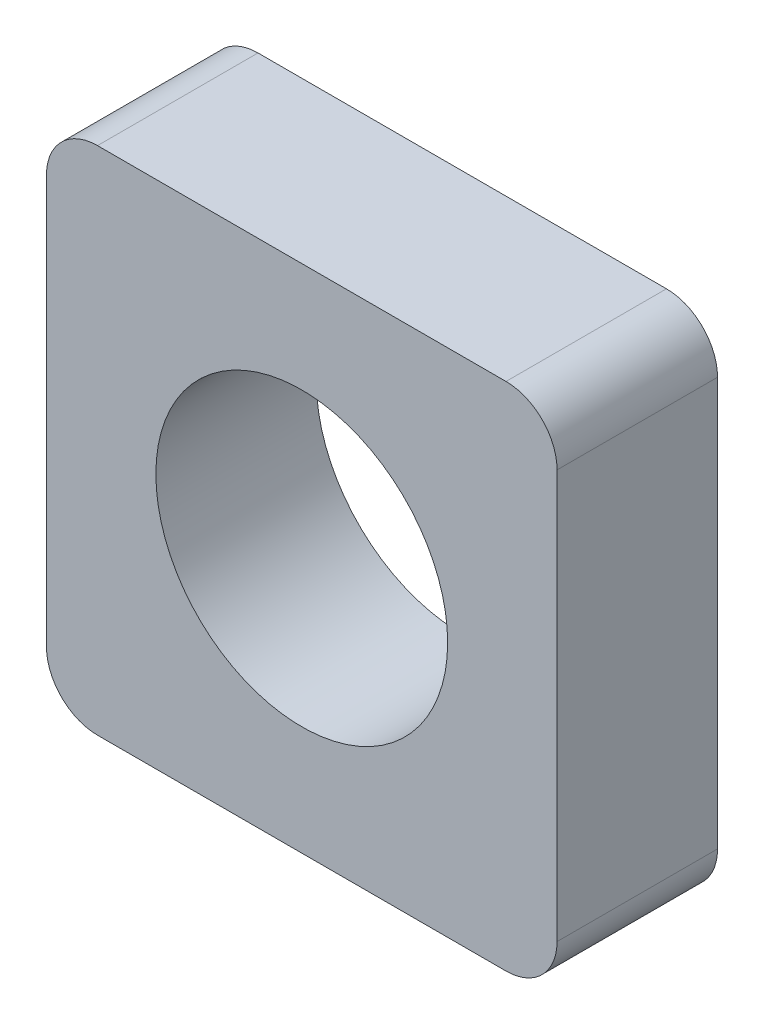
ISO-10303-21;
HEADER;
FILE_DESCRIPTION(('STEP AP214'),'2;1');
FILE_NAME('part.step','',(''),(''),'','','');
FILE_SCHEMA(('AUTOMOTIVE_DESIGN { 1 0 10303 214 1 1 1 1 }'));
ENDSEC;
DATA;
#1=APPLICATION_CONTEXT('core data for automotive mechanical design processes');
#2=APPLICATION_PROTOCOL_DEFINITION('international standard','automotive_design',2000,#1);
#3=PRODUCT_CONTEXT('',#1,'mechanical');
#4=PRODUCT('Part','Part','',(#3));
#5=PRODUCT_RELATED_PRODUCT_CATEGORY('part','',(#4));
#6=PRODUCT_DEFINITION_FORMATION('','',#4);
#7=PRODUCT_DEFINITION_CONTEXT('part definition',#1,'design');
#8=PRODUCT_DEFINITION('design','',#6,#7);
#9=PRODUCT_DEFINITION_SHAPE('','',#8);
#10=(LENGTH_UNIT() NAMED_UNIT(*) SI_UNIT(.MILLI.,.METRE.));
#11=(NAMED_UNIT(*) PLANE_ANGLE_UNIT() SI_UNIT($,.RADIAN.));
#12=(NAMED_UNIT(*) SI_UNIT($,.STERADIAN.) SOLID_ANGLE_UNIT());
#13=UNCERTAINTY_MEASURE_WITH_UNIT(LENGTH_MEASURE(1.E-05),#10,'distance_accuracy_value','');
#14=(GEOMETRIC_REPRESENTATION_CONTEXT(3) GLOBAL_UNCERTAINTY_ASSIGNED_CONTEXT((#13)) GLOBAL_UNIT_ASSIGNED_CONTEXT((#10,
#11,#12)) REPRESENTATION_CONTEXT('',''));
#15=CARTESIAN_POINT('',(0.,0.,0.));
#16=DIRECTION('',(0.,0.,1.));
#17=DIRECTION('',(1.,0.,0.));
#18=AXIS2_PLACEMENT_3D('',#15,#16,#17);
#19=CARTESIAN_POINT('',(0.,0.,2.2));
#20=DIRECTION('',(0.,0.,1.));
#21=DIRECTION('',(1.,0.,0.));
#22=AXIS2_PLACEMENT_3D('',#19,#20,#21);
#23=PLANE('',#22);
#24=DIRECTION('',(0.,-1.,0.));
#25=VECTOR('',#24,1.);
#26=CARTESIAN_POINT('',(-3.5,3.5,2.2));
#27=LINE('',#26,#25);
#28=CARTESIAN_POINT('',(-3.5,2.8,2.2));
#29=VERTEX_POINT('',#28);
#30=CARTESIAN_POINT('',(-3.5,-2.8,2.2));
#31=VERTEX_POINT('',#30);
#32=EDGE_CURVE('E178',#29,#31,#27,.T.);
#33=ORIENTED_EDGE('',*,*,#32,.T.);
#34=CARTESIAN_POINT('',(-2.8,-2.8,2.2));
#35=DIRECTION('',(0.,0.,1.));
#36=DIRECTION('',(1.,0.,0.));
#37=AXIS2_PLACEMENT_3D('',#34,#35,#36);
#38=CIRCLE('',#37,0.7);
#39=CARTESIAN_POINT('',(-2.8,-3.5,2.2));
#40=VERTEX_POINT('',#39);
#41=EDGE_CURVE('E161',#31,#40,#38,.T.);
#42=ORIENTED_EDGE('',*,*,#41,.T.);
#43=DIRECTION('',(1.,0.,0.));
#44=VECTOR('',#43,1.);
#45=CARTESIAN_POINT('',(-3.5,-3.5,2.2));
#46=LINE('',#45,#44);
#47=CARTESIAN_POINT('',(2.8,-3.5,2.2));
#48=VERTEX_POINT('',#47);
#49=EDGE_CURVE('E132',#40,#48,#46,.T.);
#50=ORIENTED_EDGE('',*,*,#49,.T.);
#51=CARTESIAN_POINT('',(2.8,-2.8,2.2));
#52=DIRECTION('',(0.,0.,1.));
#53=DIRECTION('',(1.,0.,0.));
#54=AXIS2_PLACEMENT_3D('',#51,#52,#53);
#55=CIRCLE('',#54,0.7);
#56=CARTESIAN_POINT('',(3.5,-2.8,2.2));
#57=VERTEX_POINT('',#56);
#58=EDGE_CURVE('E159',#48,#57,#55,.T.);
#59=ORIENTED_EDGE('',*,*,#58,.T.);
#60=DIRECTION('',(0.,1.,0.));
#61=VECTOR('',#60,1.);
#62=CARTESIAN_POINT('',(3.5,3.5,2.2));
#63=LINE('',#62,#61);
#64=CARTESIAN_POINT('',(3.5,2.8,2.2));
#65=VERTEX_POINT('',#64);
#66=EDGE_CURVE('E139',#57,#65,#63,.T.);
#67=ORIENTED_EDGE('',*,*,#66,.T.);
#68=CARTESIAN_POINT('',(2.8,2.8,2.2));
#69=DIRECTION('',(0.,0.,1.));
#70=DIRECTION('',(1.,0.,0.));
#71=AXIS2_PLACEMENT_3D('',#68,#69,#70);
#72=CIRCLE('',#71,0.7);
#73=CARTESIAN_POINT('',(2.8,3.5,2.2));
#74=VERTEX_POINT('',#73);
#75=EDGE_CURVE('E67',#65,#74,#72,.T.);
#76=ORIENTED_EDGE('',*,*,#75,.T.);
#77=DIRECTION('',(-1.,0.,0.));
#78=VECTOR('',#77,1.);
#79=CARTESIAN_POINT('',(-3.5,3.5,2.2));
#80=LINE('',#79,#78);
#81=CARTESIAN_POINT('',(-2.8,3.5,2.2));
#82=VERTEX_POINT('',#81);
#83=EDGE_CURVE('E142',#74,#82,#80,.T.);
#84=ORIENTED_EDGE('',*,*,#83,.T.);
#85=CARTESIAN_POINT('',(-2.8,2.8,2.2));
#86=DIRECTION('',(0.,0.,1.));
#87=DIRECTION('',(1.,0.,0.));
#88=AXIS2_PLACEMENT_3D('',#85,#86,#87);
#89=CIRCLE('',#88,0.7);
#90=EDGE_CURVE('E157',#82,#29,#89,.T.);
#91=ORIENTED_EDGE('',*,*,#90,.T.);
#92=EDGE_LOOP('',(#33,#42,#50,#59,#67,#76,#84,#91));
#93=FACE_BOUND('',#92,.T.);
#94=CARTESIAN_POINT('',(0.,0.,2.2));
#95=DIRECTION('',(0.,0.,1.));
#96=DIRECTION('',(1.,0.,0.));
#97=AXIS2_PLACEMENT_3D('',#94,#95,#96);
#98=CIRCLE('',#97,2.);
#99=CARTESIAN_POINT('',(2.,0.,2.2));
#100=VERTEX_POINT('',#99);
#101=EDGE_CURVE('E174',#100,#100,#98,.T.);
#102=ORIENTED_EDGE('',*,*,#101,.F.);
#103=EDGE_LOOP('',(#102));
#104=FACE_BOUND('',#103,.T.);
#105=ADVANCED_FACE('F47',(#93,#104),#23,.T.);
#106=CARTESIAN_POINT('',(0.,0.,0.));
#107=DIRECTION('',(0.,0.,1.));
#108=DIRECTION('',(1.,0.,0.));
#109=AXIS2_PLACEMENT_3D('',#106,#107,#108);
#110=PLANE('',#109);
#111=DIRECTION('',(1.,0.,0.));
#112=VECTOR('',#111,1.);
#113=CARTESIAN_POINT('',(-3.5,-3.5,0.));
#114=LINE('',#113,#112);
#115=CARTESIAN_POINT('',(-2.8,-3.5,0.));
#116=VERTEX_POINT('',#115);
#117=CARTESIAN_POINT('',(2.8,-3.5,0.));
#118=VERTEX_POINT('',#117);
#119=EDGE_CURVE('E129',#116,#118,#114,.T.);
#120=ORIENTED_EDGE('',*,*,#119,.F.);
#121=CARTESIAN_POINT('',(-2.8,-2.8,0.));
#122=DIRECTION('',(0.,0.,1.));
#123=DIRECTION('',(1.,0.,0.));
#124=AXIS2_PLACEMENT_3D('',#121,#122,#123);
#125=CIRCLE('',#124,0.7);
#126=CARTESIAN_POINT('',(-3.5,-2.8,0.));
#127=VERTEX_POINT('',#126);
#128=EDGE_CURVE('E112',#116,#127,#125,.F.);
#129=ORIENTED_EDGE('',*,*,#128,.T.);
#130=DIRECTION('',(0.,-1.,0.));
#131=VECTOR('',#130,1.);
#132=CARTESIAN_POINT('',(-3.5,3.5,0.));
#133=LINE('',#132,#131);
#134=CARTESIAN_POINT('',(-3.5,2.8,0.));
#135=VERTEX_POINT('',#134);
#136=EDGE_CURVE('E140',#135,#127,#133,.T.);
#137=ORIENTED_EDGE('',*,*,#136,.F.);
#138=CARTESIAN_POINT('',(-2.8,2.8,0.));
#139=DIRECTION('',(0.,0.,1.));
#140=DIRECTION('',(1.,0.,0.));
#141=AXIS2_PLACEMENT_3D('',#138,#139,#140);
#142=CIRCLE('',#141,0.7);
#143=CARTESIAN_POINT('',(-2.8,3.5,0.));
#144=VERTEX_POINT('',#143);
#145=EDGE_CURVE('E150',#135,#144,#142,.F.);
#146=ORIENTED_EDGE('',*,*,#145,.T.);
#147=DIRECTION('',(-1.,0.,0.));
#148=VECTOR('',#147,1.);
#149=CARTESIAN_POINT('',(-3.5,3.5,0.));
#150=LINE('',#149,#148);
#151=CARTESIAN_POINT('',(2.8,3.5,0.));
#152=VERTEX_POINT('',#151);
#153=EDGE_CURVE('E144',#152,#144,#150,.T.);
#154=ORIENTED_EDGE('',*,*,#153,.F.);
#155=CARTESIAN_POINT('',(2.8,2.8,0.));
#156=DIRECTION('',(0.,0.,1.));
#157=DIRECTION('',(1.,0.,0.));
#158=AXIS2_PLACEMENT_3D('',#155,#156,#157);
#159=CIRCLE('',#158,0.7);
#160=CARTESIAN_POINT('',(3.5,2.8,0.));
#161=VERTEX_POINT('',#160);
#162=EDGE_CURVE('E133',#152,#161,#159,.F.);
#163=ORIENTED_EDGE('',*,*,#162,.T.);
#164=DIRECTION('',(0.,1.,0.));
#165=VECTOR('',#164,1.);
#166=CARTESIAN_POINT('',(3.5,3.5,0.));
#167=LINE('',#166,#165);
#168=CARTESIAN_POINT('',(3.5,-2.8,0.));
#169=VERTEX_POINT('',#168);
#170=EDGE_CURVE('E173',#169,#161,#167,.T.);
#171=ORIENTED_EDGE('',*,*,#170,.F.);
#172=CARTESIAN_POINT('',(2.8,-2.8,0.));
#173=DIRECTION('',(0.,0.,1.));
#174=DIRECTION('',(1.,0.,0.));
#175=AXIS2_PLACEMENT_3D('',#172,#173,#174);
#176=CIRCLE('',#175,0.7);
#177=EDGE_CURVE('E123',#169,#118,#176,.F.);
#178=ORIENTED_EDGE('',*,*,#177,.T.);
#179=EDGE_LOOP('',(#120,#129,#137,#146,#154,#163,#171,#178));
#180=FACE_BOUND('',#179,.T.);
#181=CARTESIAN_POINT('',(0.,0.,0.));
#182=DIRECTION('',(0.,0.,1.));
#183=DIRECTION('',(1.,0.,0.));
#184=AXIS2_PLACEMENT_3D('',#181,#182,#183);
#185=CIRCLE('',#184,2.);
#186=CARTESIAN_POINT('',(2.,0.,0.));
#187=VERTEX_POINT('',#186);
#188=EDGE_CURVE('E182',#187,#187,#185,.T.);
#189=ORIENTED_EDGE('',*,*,#188,.T.);
#190=EDGE_LOOP('',(#189));
#191=FACE_BOUND('',#190,.T.);
#192=ADVANCED_FACE('F136',(#180,#191),#110,.F.);
#193=CARTESIAN_POINT('',(3.5,3.5,2.2));
#194=DIRECTION('',(-1.,0.,0.));
#195=DIRECTION('',(0.,-1.,0.));
#196=AXIS2_PLACEMENT_3D('',#193,#194,#195);
#197=PLANE('',#196);
#198=ORIENTED_EDGE('',*,*,#66,.F.);
#199=DIRECTION('',(0.,0.,-1.));
#200=VECTOR('',#199,1.);
#201=CARTESIAN_POINT('',(3.5,-2.8,2.2));
#202=LINE('',#201,#200);
#203=EDGE_CURVE('E165',#57,#169,#202,.T.);
#204=ORIENTED_EDGE('',*,*,#203,.T.);
#205=ORIENTED_EDGE('',*,*,#170,.T.);
#206=DIRECTION('',(0.,0.,-1.));
#207=VECTOR('',#206,1.);
#208=CARTESIAN_POINT('',(3.5,2.8,2.2));
#209=LINE('',#208,#207);
#210=EDGE_CURVE('E163',#161,#65,#209,.F.);
#211=ORIENTED_EDGE('',*,*,#210,.T.);
#212=EDGE_LOOP('',(#198,#204,#205,#211));
#213=FACE_BOUND('',#212,.T.);
#214=ADVANCED_FACE('F196',(#213),#197,.F.);
#215=CARTESIAN_POINT('',(-3.5,3.5,2.2));
#216=DIRECTION('',(0.,-1.,0.));
#217=DIRECTION('',(0.,0.,-1.));
#218=AXIS2_PLACEMENT_3D('',#215,#216,#217);
#219=PLANE('',#218);
#220=ORIENTED_EDGE('',*,*,#153,.T.);
#221=DIRECTION('',(0.,0.,-1.));
#222=VECTOR('',#221,1.);
#223=CARTESIAN_POINT('',(-2.8,3.5,2.2));
#224=LINE('',#223,#222);
#225=EDGE_CURVE('E13',#144,#82,#224,.F.);
#226=ORIENTED_EDGE('',*,*,#225,.T.);
#227=ORIENTED_EDGE('',*,*,#83,.F.);
#228=DIRECTION('',(0.,0.,-1.));
#229=VECTOR('',#228,1.);
#230=CARTESIAN_POINT('',(2.8,3.5,2.2));
#231=LINE('',#230,#229);
#232=EDGE_CURVE('E55',#74,#152,#231,.T.);
#233=ORIENTED_EDGE('',*,*,#232,.T.);
#234=EDGE_LOOP('',(#220,#226,#227,#233));
#235=FACE_BOUND('',#234,.T.);
#236=ADVANCED_FACE('F170',(#235),#219,.F.);
#237=CARTESIAN_POINT('',(-3.5,3.5,2.2));
#238=DIRECTION('',(1.,0.,0.));
#239=DIRECTION('',(0.,1.,0.));
#240=AXIS2_PLACEMENT_3D('',#237,#238,#239);
#241=PLANE('',#240);
#242=ORIENTED_EDGE('',*,*,#136,.T.);
#243=DIRECTION('',(0.,0.,-1.));
#244=VECTOR('',#243,1.);
#245=CARTESIAN_POINT('',(-3.5,-2.8,2.2));
#246=LINE('',#245,#244);
#247=EDGE_CURVE('E117',#127,#31,#246,.F.);
#248=ORIENTED_EDGE('',*,*,#247,.T.);
#249=ORIENTED_EDGE('',*,*,#32,.F.);
#250=DIRECTION('',(0.,0.,-1.));
#251=VECTOR('',#250,1.);
#252=CARTESIAN_POINT('',(-3.5,2.8,2.2));
#253=LINE('',#252,#251);
#254=EDGE_CURVE('E122',#29,#135,#253,.T.);
#255=ORIENTED_EDGE('',*,*,#254,.T.);
#256=EDGE_LOOP('',(#242,#248,#249,#255));
#257=FACE_BOUND('',#256,.T.);
#258=ADVANCED_FACE('F202',(#257),#241,.F.);
#259=CARTESIAN_POINT('',(-3.5,-3.5,2.2));
#260=DIRECTION('',(0.,1.,0.));
#261=DIRECTION('',(0.,0.,1.));
#262=AXIS2_PLACEMENT_3D('',#259,#260,#261);
#263=PLANE('',#262);
#264=ORIENTED_EDGE('',*,*,#49,.F.);
#265=DIRECTION('',(0.,0.,-1.));
#266=VECTOR('',#265,1.);
#267=CARTESIAN_POINT('',(-2.8,-3.5,2.2));
#268=LINE('',#267,#266);
#269=EDGE_CURVE('E116',#40,#116,#268,.T.);
#270=ORIENTED_EDGE('',*,*,#269,.T.);
#271=ORIENTED_EDGE('',*,*,#119,.T.);
#272=DIRECTION('',(0.,0.,-1.));
#273=VECTOR('',#272,1.);
#274=CARTESIAN_POINT('',(2.8,-3.5,2.2));
#275=LINE('',#274,#273);
#276=EDGE_CURVE('E134',#118,#48,#275,.F.);
#277=ORIENTED_EDGE('',*,*,#276,.T.);
#278=EDGE_LOOP('',(#264,#270,#271,#277));
#279=FACE_BOUND('',#278,.T.);
#280=ADVANCED_FACE('F128',(#279),#263,.F.);
#281=CARTESIAN_POINT('',(0.,0.,2.2));
#282=DIRECTION('',(0.,0.,-1.));
#283=DIRECTION('',(-1.,0.,0.));
#284=AXIS2_PLACEMENT_3D('',#281,#282,#283);
#285=CYLINDRICAL_SURFACE('',#284,2.);
#286=ORIENTED_EDGE('',*,*,#101,.T.);
#287=EDGE_LOOP('',(#286));
#288=FACE_BOUND('',#287,.T.);
#289=ORIENTED_EDGE('',*,*,#188,.F.);
#290=EDGE_LOOP('',(#289));
#291=FACE_BOUND('',#290,.T.);
#292=ADVANCED_FACE('F188',(#288,#291),#285,.F.);
#293=CARTESIAN_POINT('',(-2.8,-2.8,2.2));
#294=DIRECTION('',(0.,0.,-1.));
#295=DIRECTION('',(-1.,0.,0.));
#296=AXIS2_PLACEMENT_3D('',#293,#294,#295);
#297=CYLINDRICAL_SURFACE('',#296,0.7);
#298=ORIENTED_EDGE('',*,*,#41,.F.);
#299=ORIENTED_EDGE('',*,*,#247,.F.);
#300=ORIENTED_EDGE('',*,*,#128,.F.);
#301=ORIENTED_EDGE('',*,*,#269,.F.);
#302=EDGE_LOOP('',(#298,#299,#300,#301));
#303=FACE_BOUND('',#302,.T.);
#304=ADVANCED_FACE('F115',(#303),#297,.T.);
#305=CARTESIAN_POINT('',(2.8,-2.8,2.2));
#306=DIRECTION('',(0.,0.,-1.));
#307=DIRECTION('',(-1.,0.,0.));
#308=AXIS2_PLACEMENT_3D('',#305,#306,#307);
#309=CYLINDRICAL_SURFACE('',#308,0.7);
#310=ORIENTED_EDGE('',*,*,#58,.F.);
#311=ORIENTED_EDGE('',*,*,#276,.F.);
#312=ORIENTED_EDGE('',*,*,#177,.F.);
#313=ORIENTED_EDGE('',*,*,#203,.F.);
#314=EDGE_LOOP('',(#310,#311,#312,#313));
#315=FACE_BOUND('',#314,.T.);
#316=ADVANCED_FACE('F213',(#315),#309,.T.);
#317=CARTESIAN_POINT('',(-2.8,2.8,2.2));
#318=DIRECTION('',(0.,0.,-1.));
#319=DIRECTION('',(-1.,0.,0.));
#320=AXIS2_PLACEMENT_3D('',#317,#318,#319);
#321=CYLINDRICAL_SURFACE('',#320,0.7);
#322=ORIENTED_EDGE('',*,*,#90,.F.);
#323=ORIENTED_EDGE('',*,*,#225,.F.);
#324=ORIENTED_EDGE('',*,*,#145,.F.);
#325=ORIENTED_EDGE('',*,*,#254,.F.);
#326=EDGE_LOOP('',(#322,#323,#324,#325));
#327=FACE_BOUND('',#326,.T.);
#328=ADVANCED_FACE('F215',(#327),#321,.T.);
#329=CARTESIAN_POINT('',(2.8,2.8,2.2));
#330=DIRECTION('',(0.,0.,-1.));
#331=DIRECTION('',(-1.,0.,0.));
#332=AXIS2_PLACEMENT_3D('',#329,#330,#331);
#333=CYLINDRICAL_SURFACE('',#332,0.7);
#334=ORIENTED_EDGE('',*,*,#75,.F.);
#335=ORIENTED_EDGE('',*,*,#210,.F.);
#336=ORIENTED_EDGE('',*,*,#162,.F.);
#337=ORIENTED_EDGE('',*,*,#232,.F.);
#338=EDGE_LOOP('',(#334,#335,#336,#337));
#339=FACE_BOUND('',#338,.T.);
#340=ADVANCED_FACE('F49',(#339),#333,.T.);
#341=CLOSED_SHELL('',(#105,#192,#214,#236,#258,#280,#292,#304,#316,#328,#340));
#342=MANIFOLD_SOLID_BREP('B2',#341);
#343=ADVANCED_BREP_SHAPE_REPRESENTATION('',(#18,#342),#14);
#344=SHAPE_DEFINITION_REPRESENTATION(#9,#343);
ENDSEC;
END-ISO-10303-21;
